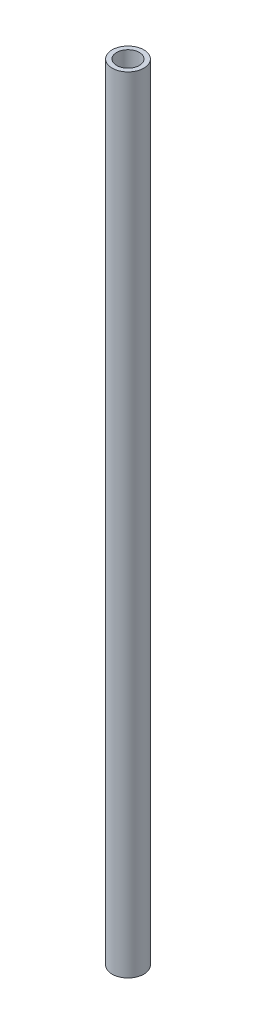
ISO-10303-21;
HEADER;
FILE_DESCRIPTION(('STEP AP214'),'2;1');
FILE_NAME('part.step','',(''),(''),'','','');
FILE_SCHEMA(('AUTOMOTIVE_DESIGN { 1 0 10303 214 1 1 1 1 }'));
ENDSEC;
DATA;
#1=APPLICATION_CONTEXT('core data for automotive mechanical design processes');
#2=APPLICATION_PROTOCOL_DEFINITION('international standard','automotive_design',2000,#1);
#3=PRODUCT_CONTEXT('',#1,'mechanical');
#4=PRODUCT('Part','Part','',(#3));
#5=PRODUCT_RELATED_PRODUCT_CATEGORY('part','',(#4));
#6=PRODUCT_DEFINITION_FORMATION('','',#4);
#7=PRODUCT_DEFINITION_CONTEXT('part definition',#1,'design');
#8=PRODUCT_DEFINITION('design','',#6,#7);
#9=PRODUCT_DEFINITION_SHAPE('','',#8);
#10=(LENGTH_UNIT() NAMED_UNIT(*) SI_UNIT(.MILLI.,.METRE.));
#11=(NAMED_UNIT(*) PLANE_ANGLE_UNIT() SI_UNIT($,.RADIAN.));
#12=(NAMED_UNIT(*) SI_UNIT($,.STERADIAN.) SOLID_ANGLE_UNIT());
#13=UNCERTAINTY_MEASURE_WITH_UNIT(LENGTH_MEASURE(1.E-05),#10,'distance_accuracy_value','');
#14=(GEOMETRIC_REPRESENTATION_CONTEXT(3) GLOBAL_UNCERTAINTY_ASSIGNED_CONTEXT((#13)) GLOBAL_UNIT_ASSIGNED_CONTEXT((#10,
#11,#12)) REPRESENTATION_CONTEXT('',''));
#15=CARTESIAN_POINT('',(0.,0.,0.));
#16=DIRECTION('',(0.,0.,1.));
#17=DIRECTION('',(1.,0.,0.));
#18=AXIS2_PLACEMENT_3D('',#15,#16,#17);
#19=CARTESIAN_POINT('',(0.,173.,0.));
#20=DIRECTION('',(0.,1.,0.));
#21=DIRECTION('',(0.,0.,1.));
#22=AXIS2_PLACEMENT_3D('',#19,#20,#21);
#23=PLANE('',#22);
#24=CARTESIAN_POINT('',(0.,173.,0.));
#25=DIRECTION('',(0.,1.,0.));
#26=DIRECTION('',(0.,0.,1.));
#27=AXIS2_PLACEMENT_3D('',#24,#25,#26);
#28=CIRCLE('',#27,3.5);
#29=CARTESIAN_POINT('',(0.,173.,3.5));
#30=VERTEX_POINT('',#29);
#31=EDGE_CURVE('E10',#30,#30,#28,.T.);
#32=ORIENTED_EDGE('',*,*,#31,.T.);
#33=EDGE_LOOP('',(#32));
#34=FACE_BOUND('',#33,.T.);
#35=CARTESIAN_POINT('',(0.,173.,0.));
#36=DIRECTION('',(0.,1.,0.));
#37=DIRECTION('',(0.,0.,1.));
#38=AXIS2_PLACEMENT_3D('',#35,#36,#37);
#39=CIRCLE('',#38,2.5);
#40=CARTESIAN_POINT('',(0.,173.,2.5));
#41=VERTEX_POINT('',#40);
#42=EDGE_CURVE('E56',#41,#41,#39,.T.);
#43=ORIENTED_EDGE('',*,*,#42,.F.);
#44=EDGE_LOOP('',(#43));
#45=FACE_BOUND('',#44,.T.);
#46=ADVANCED_FACE('F43',(#34,#45),#23,.T.);
#47=CARTESIAN_POINT('',(0.,0.,0.));
#48=DIRECTION('',(0.,1.,0.));
#49=DIRECTION('',(0.,0.,1.));
#50=AXIS2_PLACEMENT_3D('',#47,#48,#49);
#51=PLANE('',#50);
#52=CARTESIAN_POINT('',(0.,0.,0.));
#53=DIRECTION('',(0.,1.,0.));
#54=DIRECTION('',(0.,0.,1.));
#55=AXIS2_PLACEMENT_3D('',#52,#53,#54);
#56=CIRCLE('',#55,3.5);
#57=CARTESIAN_POINT('',(0.,0.,3.5));
#58=VERTEX_POINT('',#57);
#59=EDGE_CURVE('E47',#58,#58,#56,.T.);
#60=ORIENTED_EDGE('',*,*,#59,.F.);
#61=EDGE_LOOP('',(#60));
#62=FACE_BOUND('',#61,.T.);
#63=CARTESIAN_POINT('',(0.,0.,0.));
#64=DIRECTION('',(0.,1.,0.));
#65=DIRECTION('',(0.,0.,1.));
#66=AXIS2_PLACEMENT_3D('',#63,#64,#65);
#67=CIRCLE('',#66,2.5);
#68=CARTESIAN_POINT('',(0.,0.,2.5));
#69=VERTEX_POINT('',#68);
#70=EDGE_CURVE('E58',#69,#69,#67,.T.);
#71=ORIENTED_EDGE('',*,*,#70,.T.);
#72=EDGE_LOOP('',(#71));
#73=FACE_BOUND('',#72,.T.);
#74=ADVANCED_FACE('F70',(#62,#73),#51,.F.);
#75=CARTESIAN_POINT('',(0.,173.,0.));
#76=DIRECTION('',(0.,-1.,0.));
#77=DIRECTION('',(0.,0.,-1.));
#78=AXIS2_PLACEMENT_3D('',#75,#76,#77);
#79=CYLINDRICAL_SURFACE('',#78,3.5);
#80=ORIENTED_EDGE('',*,*,#31,.F.);
#81=EDGE_LOOP('',(#80));
#82=FACE_BOUND('',#81,.T.);
#83=ORIENTED_EDGE('',*,*,#59,.T.);
#84=EDGE_LOOP('',(#83));
#85=FACE_BOUND('',#84,.T.);
#86=ADVANCED_FACE('F45',(#82,#85),#79,.T.);
#87=CARTESIAN_POINT('',(0.,173.,0.));
#88=DIRECTION('',(0.,-1.,0.));
#89=DIRECTION('',(0.,0.,-1.));
#90=AXIS2_PLACEMENT_3D('',#87,#88,#89);
#91=CYLINDRICAL_SURFACE('',#90,2.5);
#92=ORIENTED_EDGE('',*,*,#42,.T.);
#93=EDGE_LOOP('',(#92));
#94=FACE_BOUND('',#93,.T.);
#95=ORIENTED_EDGE('',*,*,#70,.F.);
#96=EDGE_LOOP('',(#95));
#97=FACE_BOUND('',#96,.T.);
#98=ADVANCED_FACE('F66',(#94,#97),#91,.F.);
#99=CLOSED_SHELL('',(#46,#74,#86,#98));
#100=MANIFOLD_SOLID_BREP('B2',#99);
#101=ADVANCED_BREP_SHAPE_REPRESENTATION('',(#18,#100),#14);
#102=SHAPE_DEFINITION_REPRESENTATION(#9,#101);
ENDSEC;
END-ISO-10303-21;
